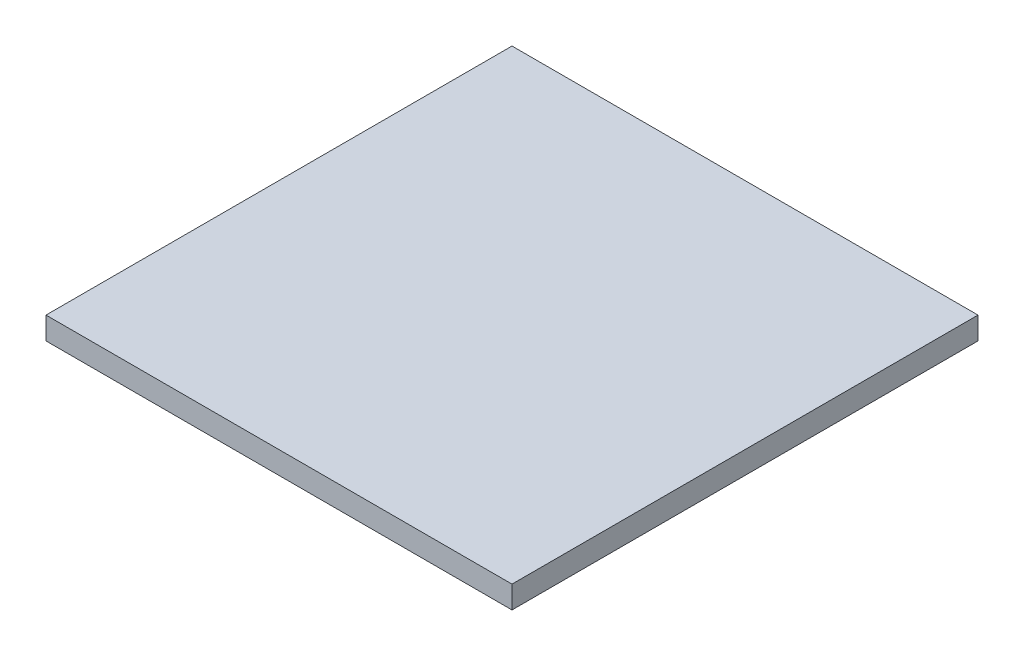
ISO-10303-21;
HEADER;
FILE_DESCRIPTION(('STEP AP214'),'2;1');
FILE_NAME('part.step','',(''),(''),'','','');
FILE_SCHEMA(('AUTOMOTIVE_DESIGN { 1 0 10303 214 1 1 1 1 }'));
ENDSEC;
DATA;
#1=APPLICATION_CONTEXT('core data for automotive mechanical design processes');
#2=APPLICATION_PROTOCOL_DEFINITION('international standard','automotive_design',2000,#1);
#3=PRODUCT_CONTEXT('',#1,'mechanical');
#4=PRODUCT('Part','Part','',(#3));
#5=PRODUCT_RELATED_PRODUCT_CATEGORY('part','',(#4));
#6=PRODUCT_DEFINITION_FORMATION('','',#4);
#7=PRODUCT_DEFINITION_CONTEXT('part definition',#1,'design');
#8=PRODUCT_DEFINITION('design','',#6,#7);
#9=PRODUCT_DEFINITION_SHAPE('','',#8);
#10=(LENGTH_UNIT() NAMED_UNIT(*) SI_UNIT(.MILLI.,.METRE.));
#11=(NAMED_UNIT(*) PLANE_ANGLE_UNIT() SI_UNIT($,.RADIAN.));
#12=(NAMED_UNIT(*) SI_UNIT($,.STERADIAN.) SOLID_ANGLE_UNIT());
#13=UNCERTAINTY_MEASURE_WITH_UNIT(LENGTH_MEASURE(1.E-05),#10,'distance_accuracy_value','');
#14=(GEOMETRIC_REPRESENTATION_CONTEXT(3) GLOBAL_UNCERTAINTY_ASSIGNED_CONTEXT((#13)) GLOBAL_UNIT_ASSIGNED_CONTEXT((#10,
#11,#12)) REPRESENTATION_CONTEXT('',''));
#15=CARTESIAN_POINT('',(0.,0.,0.));
#16=DIRECTION('',(0.,0.,1.));
#17=DIRECTION('',(1.,0.,0.));
#18=AXIS2_PLACEMENT_3D('',#15,#16,#17);
#19=CARTESIAN_POINT('',(0.,5.,0.));
#20=DIRECTION('',(1.,0.,0.));
#21=DIRECTION('',(0.,0.,-1.));
#22=AXIS2_PLACEMENT_3D('',#19,#20,#21);
#23=PLANE('',#22);
#24=DIRECTION('',(0.,0.,1.));
#25=VECTOR('',#24,1.);
#26=CARTESIAN_POINT('',(0.,0.,0.));
#27=LINE('',#26,#25);
#28=CARTESIAN_POINT('',(0.,0.,-104.));
#29=VERTEX_POINT('',#28);
#30=CARTESIAN_POINT('',(0.,0.,0.));
#31=VERTEX_POINT('',#30);
#32=EDGE_CURVE('E96',#29,#31,#27,.T.);
#33=ORIENTED_EDGE('',*,*,#32,.T.);
#34=DIRECTION('',(0.,-1.,0.));
#35=VECTOR('',#34,1.);
#36=CARTESIAN_POINT('',(0.,5.,0.));
#37=LINE('',#36,#35);
#38=CARTESIAN_POINT('',(0.,5.,0.));
#39=VERTEX_POINT('',#38);
#40=EDGE_CURVE('E11',#39,#31,#37,.T.);
#41=ORIENTED_EDGE('',*,*,#40,.F.);
#42=DIRECTION('',(0.,0.,1.));
#43=VECTOR('',#42,1.);
#44=CARTESIAN_POINT('',(0.,5.,0.));
#45=LINE('',#44,#43);
#46=CARTESIAN_POINT('',(0.,5.,-104.));
#47=VERTEX_POINT('',#46);
#48=EDGE_CURVE('E84',#47,#39,#45,.T.);
#49=ORIENTED_EDGE('',*,*,#48,.F.);
#50=DIRECTION('',(0.,-1.,0.));
#51=VECTOR('',#50,1.);
#52=CARTESIAN_POINT('',(0.,5.,-104.));
#53=LINE('',#52,#51);
#54=EDGE_CURVE('E92',#47,#29,#53,.T.);
#55=ORIENTED_EDGE('',*,*,#54,.T.);
#56=EDGE_LOOP('',(#33,#41,#49,#55));
#57=FACE_BOUND('',#56,.T.);
#58=ADVANCED_FACE('F33',(#57),#23,.F.);
#59=CARTESIAN_POINT('',(0.,5.,0.));
#60=DIRECTION('',(0.,0.,-1.));
#61=DIRECTION('',(-1.,0.,0.));
#62=AXIS2_PLACEMENT_3D('',#59,#60,#61);
#63=PLANE('',#62);
#64=DIRECTION('',(1.,0.,0.));
#65=VECTOR('',#64,1.);
#66=CARTESIAN_POINT('',(0.,0.,0.));
#67=LINE('',#66,#65);
#68=CARTESIAN_POINT('',(104.,0.,0.));
#69=VERTEX_POINT('',#68);
#70=EDGE_CURVE('E88',#31,#69,#67,.T.);
#71=ORIENTED_EDGE('',*,*,#70,.T.);
#72=DIRECTION('',(0.,-1.,0.));
#73=VECTOR('',#72,1.);
#74=CARTESIAN_POINT('',(104.,5.,0.));
#75=LINE('',#74,#73);
#76=CARTESIAN_POINT('',(104.,5.,0.));
#77=VERTEX_POINT('',#76);
#78=EDGE_CURVE('E41',#77,#69,#75,.T.);
#79=ORIENTED_EDGE('',*,*,#78,.F.);
#80=DIRECTION('',(1.,0.,0.));
#81=VECTOR('',#80,1.);
#82=CARTESIAN_POINT('',(0.,5.,0.));
#83=LINE('',#82,#81);
#84=EDGE_CURVE('E79',#39,#77,#83,.T.);
#85=ORIENTED_EDGE('',*,*,#84,.F.);
#86=ORIENTED_EDGE('',*,*,#40,.T.);
#87=EDGE_LOOP('',(#71,#79,#85,#86));
#88=FACE_BOUND('',#87,.T.);
#89=ADVANCED_FACE('F87',(#88),#63,.F.);
#90=CARTESIAN_POINT('',(104.,5.,0.));
#91=DIRECTION('',(-1.,0.,0.));
#92=DIRECTION('',(0.,0.,1.));
#93=AXIS2_PLACEMENT_3D('',#90,#91,#92);
#94=PLANE('',#93);
#95=DIRECTION('',(0.,0.,-1.));
#96=VECTOR('',#95,1.);
#97=CARTESIAN_POINT('',(104.,0.,0.));
#98=LINE('',#97,#96);
#99=CARTESIAN_POINT('',(104.,0.,-104.));
#100=VERTEX_POINT('',#99);
#101=EDGE_CURVE('E66',#69,#100,#98,.T.);
#102=ORIENTED_EDGE('',*,*,#101,.T.);
#103=DIRECTION('',(0.,-1.,0.));
#104=VECTOR('',#103,1.);
#105=CARTESIAN_POINT('',(104.,5.,-104.));
#106=LINE('',#105,#104);
#107=CARTESIAN_POINT('',(104.,5.,-104.));
#108=VERTEX_POINT('',#107);
#109=EDGE_CURVE('E89',#108,#100,#106,.T.);
#110=ORIENTED_EDGE('',*,*,#109,.F.);
#111=DIRECTION('',(0.,0.,-1.));
#112=VECTOR('',#111,1.);
#113=CARTESIAN_POINT('',(104.,5.,0.));
#114=LINE('',#113,#112);
#115=EDGE_CURVE('E82',#77,#108,#114,.T.);
#116=ORIENTED_EDGE('',*,*,#115,.F.);
#117=ORIENTED_EDGE('',*,*,#78,.T.);
#118=EDGE_LOOP('',(#102,#110,#116,#117));
#119=FACE_BOUND('',#118,.T.);
#120=ADVANCED_FACE('F90',(#119),#94,.F.);
#121=CARTESIAN_POINT('',(0.,5.,-104.));
#122=DIRECTION('',(0.,0.,1.));
#123=DIRECTION('',(1.,0.,0.));
#124=AXIS2_PLACEMENT_3D('',#121,#122,#123);
#125=PLANE('',#124);
#126=DIRECTION('',(-1.,0.,0.));
#127=VECTOR('',#126,1.);
#128=CARTESIAN_POINT('',(0.,0.,-104.));
#129=LINE('',#128,#127);
#130=EDGE_CURVE('E72',#100,#29,#129,.T.);
#131=ORIENTED_EDGE('',*,*,#130,.T.);
#132=ORIENTED_EDGE('',*,*,#54,.F.);
#133=DIRECTION('',(-1.,0.,0.));
#134=VECTOR('',#133,1.);
#135=CARTESIAN_POINT('',(0.,5.,-104.));
#136=LINE('',#135,#134);
#137=EDGE_CURVE('E49',#108,#47,#136,.T.);
#138=ORIENTED_EDGE('',*,*,#137,.F.);
#139=ORIENTED_EDGE('',*,*,#109,.T.);
#140=EDGE_LOOP('',(#131,#132,#138,#139));
#141=FACE_BOUND('',#140,.T.);
#142=ADVANCED_FACE('F103',(#141),#125,.F.);
#143=CARTESIAN_POINT('',(0.,5.,0.));
#144=DIRECTION('',(0.,-1.,0.));
#145=DIRECTION('',(0.,0.,-1.));
#146=AXIS2_PLACEMENT_3D('',#143,#144,#145);
#147=PLANE('',#146);
#148=ORIENTED_EDGE('',*,*,#48,.T.);
#149=ORIENTED_EDGE('',*,*,#84,.T.);
#150=ORIENTED_EDGE('',*,*,#115,.T.);
#151=ORIENTED_EDGE('',*,*,#137,.T.);
#152=EDGE_LOOP('',(#148,#149,#150,#151));
#153=FACE_BOUND('',#152,.T.);
#154=ADVANCED_FACE('F80',(#153),#147,.F.);
#155=CARTESIAN_POINT('',(0.,0.,0.));
#156=DIRECTION('',(0.,-1.,0.));
#157=DIRECTION('',(0.,0.,-1.));
#158=AXIS2_PLACEMENT_3D('',#155,#156,#157);
#159=PLANE('',#158);
#160=ORIENTED_EDGE('',*,*,#32,.F.);
#161=ORIENTED_EDGE('',*,*,#130,.F.);
#162=ORIENTED_EDGE('',*,*,#101,.F.);
#163=ORIENTED_EDGE('',*,*,#70,.F.);
#164=EDGE_LOOP('',(#160,#161,#162,#163));
#165=FACE_BOUND('',#164,.T.);
#166=ADVANCED_FACE('F106',(#165),#159,.T.);
#167=CLOSED_SHELL('',(#58,#89,#120,#142,#154,#166));
#168=MANIFOLD_SOLID_BREP('B2',#167);
#169=ADVANCED_BREP_SHAPE_REPRESENTATION('',(#18,#168),#14);
#170=SHAPE_DEFINITION_REPRESENTATION(#9,#169);
ENDSEC;
END-ISO-10303-21;
